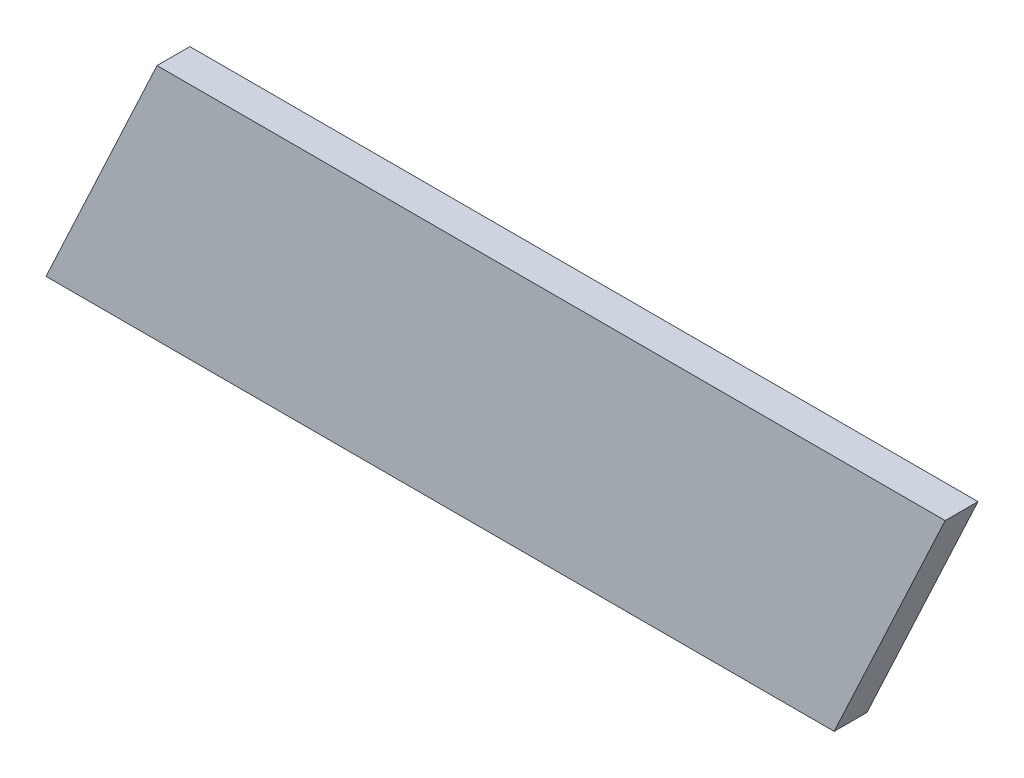
ISO-10303-21;
HEADER;
FILE_DESCRIPTION(('STEP AP214'),'2;1');
FILE_NAME('part.step','',(''),(''),'','','');
FILE_SCHEMA(('AUTOMOTIVE_DESIGN { 1 0 10303 214 1 1 1 1 }'));
ENDSEC;
DATA;
#1=APPLICATION_CONTEXT('core data for automotive mechanical design processes');
#2=APPLICATION_PROTOCOL_DEFINITION('international standard','automotive_design',2000,#1);
#3=PRODUCT_CONTEXT('',#1,'mechanical');
#4=PRODUCT('Part','Part','',(#3));
#5=PRODUCT_RELATED_PRODUCT_CATEGORY('part','',(#4));
#6=PRODUCT_DEFINITION_FORMATION('','',#4);
#7=PRODUCT_DEFINITION_CONTEXT('part definition',#1,'design');
#8=PRODUCT_DEFINITION('design','',#6,#7);
#9=PRODUCT_DEFINITION_SHAPE('','',#8);
#10=(LENGTH_UNIT() NAMED_UNIT(*) SI_UNIT(.MILLI.,.METRE.));
#11=(NAMED_UNIT(*) PLANE_ANGLE_UNIT() SI_UNIT($,.RADIAN.));
#12=(NAMED_UNIT(*) SI_UNIT($,.STERADIAN.) SOLID_ANGLE_UNIT());
#13=UNCERTAINTY_MEASURE_WITH_UNIT(LENGTH_MEASURE(1.E-05),#10,'distance_accuracy_value','');
#14=(GEOMETRIC_REPRESENTATION_CONTEXT(3) GLOBAL_UNCERTAINTY_ASSIGNED_CONTEXT((#13)) GLOBAL_UNIT_ASSIGNED_CONTEXT((#10,
#11,#12)) REPRESENTATION_CONTEXT('',''));
#15=CARTESIAN_POINT('',(0.,0.,0.));
#16=DIRECTION('',(0.,0.,1.));
#17=DIRECTION('',(1.,0.,0.));
#18=AXIS2_PLACEMENT_3D('',#15,#16,#17);
#19=CARTESIAN_POINT('',(0.,0.,5.));
#20=DIRECTION('',(0.906307787036651,-0.422618261740697,0.));
#21=DIRECTION('',(0.422618261740697,0.906307787036651,0.));
#22=AXIS2_PLACEMENT_3D('',#19,#20,#21);
#23=PLANE('',#22);
#24=DIRECTION('',(-0.422618261740697,-0.906307787036651,0.));
#25=VECTOR('',#24,1.);
#26=CARTESIAN_POINT('',(0.,0.,0.));
#27=LINE('',#26,#25);
#28=CARTESIAN_POINT('',(16.9047304696279,36.252311481466,0.));
#29=VERTEX_POINT('',#28);
#30=CARTESIAN_POINT('',(0.,0.,0.));
#31=VERTEX_POINT('',#30);
#32=EDGE_CURVE('E107',#29,#31,#27,.T.);
#33=ORIENTED_EDGE('',*,*,#32,.T.);
#34=DIRECTION('',(0.,0.,-1.));
#35=VECTOR('',#34,1.);
#36=CARTESIAN_POINT('',(0.,0.,5.));
#37=LINE('',#36,#35);
#38=CARTESIAN_POINT('',(0.,0.,5.));
#39=VERTEX_POINT('',#38);
#40=EDGE_CURVE('E11',#39,#31,#37,.T.);
#41=ORIENTED_EDGE('',*,*,#40,.F.);
#42=DIRECTION('',(-0.422618261740697,-0.906307787036651,0.));
#43=VECTOR('',#42,1.);
#44=CARTESIAN_POINT('',(0.,0.,5.));
#45=LINE('',#44,#43);
#46=CARTESIAN_POINT('',(16.9047304696279,36.252311481466,5.));
#47=VERTEX_POINT('',#46);
#48=EDGE_CURVE('E91',#47,#39,#45,.T.);
#49=ORIENTED_EDGE('',*,*,#48,.F.);
#50=DIRECTION('',(0.,0.,-1.));
#51=VECTOR('',#50,1.);
#52=CARTESIAN_POINT('',(16.9047304696279,36.252311481466,5.));
#53=LINE('',#52,#51);
#54=EDGE_CURVE('E103',#47,#29,#53,.T.);
#55=ORIENTED_EDGE('',*,*,#54,.T.);
#56=EDGE_LOOP('',(#33,#41,#49,#55));
#57=FACE_BOUND('',#56,.T.);
#58=ADVANCED_FACE('F39',(#57),#23,.F.);
#59=CARTESIAN_POINT('',(0.,0.,5.));
#60=DIRECTION('',(0.,1.,0.));
#61=DIRECTION('',(-1.,0.,0.));
#62=AXIS2_PLACEMENT_3D('',#59,#60,#61);
#63=PLANE('',#62);
#64=DIRECTION('',(1.,0.,0.));
#65=VECTOR('',#64,1.);
#66=CARTESIAN_POINT('',(0.,0.,0.));
#67=LINE('',#66,#65);
#68=CARTESIAN_POINT('',(120.,0.,0.));
#69=VERTEX_POINT('',#68);
#70=EDGE_CURVE('E96',#31,#69,#67,.T.);
#71=ORIENTED_EDGE('',*,*,#70,.T.);
#72=DIRECTION('',(0.,0.,-1.));
#73=VECTOR('',#72,1.);
#74=CARTESIAN_POINT('',(120.,0.,5.));
#75=LINE('',#74,#73);
#76=CARTESIAN_POINT('',(120.,0.,5.));
#77=VERTEX_POINT('',#76);
#78=EDGE_CURVE('E48',#77,#69,#75,.T.);
#79=ORIENTED_EDGE('',*,*,#78,.F.);
#80=DIRECTION('',(1.,0.,0.));
#81=VECTOR('',#80,1.);
#82=CARTESIAN_POINT('',(0.,0.,5.));
#83=LINE('',#82,#81);
#84=EDGE_CURVE('E86',#39,#77,#83,.T.);
#85=ORIENTED_EDGE('',*,*,#84,.F.);
#86=ORIENTED_EDGE('',*,*,#40,.T.);
#87=EDGE_LOOP('',(#71,#79,#85,#86));
#88=FACE_BOUND('',#87,.T.);
#89=ADVANCED_FACE('F95',(#88),#63,.F.);
#90=CARTESIAN_POINT('',(120.,0.,5.));
#91=DIRECTION('',(-0.906307787036651,0.422618261740697,0.));
#92=DIRECTION('',(-0.422618261740697,-0.906307787036651,0.));
#93=AXIS2_PLACEMENT_3D('',#90,#91,#92);
#94=PLANE('',#93);
#95=DIRECTION('',(0.422618261740697,0.906307787036651,0.));
#96=VECTOR('',#95,1.);
#97=CARTESIAN_POINT('',(120.,0.,0.));
#98=LINE('',#97,#96);
#99=CARTESIAN_POINT('',(136.904730469628,36.252311481466,0.));
#100=VERTEX_POINT('',#99);
#101=EDGE_CURVE('E73',#69,#100,#98,.T.);
#102=ORIENTED_EDGE('',*,*,#101,.T.);
#103=DIRECTION('',(0.,0.,-1.));
#104=VECTOR('',#103,1.);
#105=CARTESIAN_POINT('',(136.904730469628,36.252311481466,5.));
#106=LINE('',#105,#104);
#107=CARTESIAN_POINT('',(136.904730469628,36.252311481466,5.));
#108=VERTEX_POINT('',#107);
#109=EDGE_CURVE('E98',#108,#100,#106,.T.);
#110=ORIENTED_EDGE('',*,*,#109,.F.);
#111=DIRECTION('',(0.422618261740697,0.906307787036651,0.));
#112=VECTOR('',#111,1.);
#113=CARTESIAN_POINT('',(120.,0.,5.));
#114=LINE('',#113,#112);
#115=EDGE_CURVE('E89',#77,#108,#114,.T.);
#116=ORIENTED_EDGE('',*,*,#115,.F.);
#117=ORIENTED_EDGE('',*,*,#78,.T.);
#118=EDGE_LOOP('',(#102,#110,#116,#117));
#119=FACE_BOUND('',#118,.T.);
#120=ADVANCED_FACE('F99',(#119),#94,.F.);
#121=CARTESIAN_POINT('',(16.9047304696279,36.252311481466,5.));
#122=DIRECTION('',(0.,-1.,0.));
#123=DIRECTION('',(0.,0.,-1.));
#124=AXIS2_PLACEMENT_3D('',#121,#122,#123);
#125=PLANE('',#124);
#126=DIRECTION('',(-1.,0.,0.));
#127=VECTOR('',#126,1.);
#128=CARTESIAN_POINT('',(16.9047304696279,36.252311481466,0.));
#129=LINE('',#128,#127);
#130=EDGE_CURVE('E79',#100,#29,#129,.T.);
#131=ORIENTED_EDGE('',*,*,#130,.T.);
#132=ORIENTED_EDGE('',*,*,#54,.F.);
#133=DIRECTION('',(-1.,0.,0.));
#134=VECTOR('',#133,1.);
#135=CARTESIAN_POINT('',(16.9047304696279,36.252311481466,5.));
#136=LINE('',#135,#134);
#137=EDGE_CURVE('E56',#108,#47,#136,.T.);
#138=ORIENTED_EDGE('',*,*,#137,.F.);
#139=ORIENTED_EDGE('',*,*,#109,.T.);
#140=EDGE_LOOP('',(#131,#132,#138,#139));
#141=FACE_BOUND('',#140,.T.);
#142=ADVANCED_FACE('F120',(#141),#125,.F.);
#143=CARTESIAN_POINT('',(0.,0.,5.));
#144=DIRECTION('',(0.,0.,-1.));
#145=DIRECTION('',(-1.,0.,0.));
#146=AXIS2_PLACEMENT_3D('',#143,#144,#145);
#147=PLANE('',#146);
#148=ORIENTED_EDGE('',*,*,#48,.T.);
#149=ORIENTED_EDGE('',*,*,#84,.T.);
#150=ORIENTED_EDGE('',*,*,#115,.T.);
#151=ORIENTED_EDGE('',*,*,#137,.T.);
#152=EDGE_LOOP('',(#148,#149,#150,#151));
#153=FACE_BOUND('',#152,.T.);
#154=ADVANCED_FACE('F87',(#153),#147,.F.);
#155=CARTESIAN_POINT('',(0.,0.,0.));
#156=DIRECTION('',(0.,0.,-1.));
#157=DIRECTION('',(-1.,0.,0.));
#158=AXIS2_PLACEMENT_3D('',#155,#156,#157);
#159=PLANE('',#158);
#160=ORIENTED_EDGE('',*,*,#32,.F.);
#161=ORIENTED_EDGE('',*,*,#130,.F.);
#162=ORIENTED_EDGE('',*,*,#101,.F.);
#163=ORIENTED_EDGE('',*,*,#70,.F.);
#164=EDGE_LOOP('',(#160,#161,#162,#163));
#165=FACE_BOUND('',#164,.T.);
#166=ADVANCED_FACE('F123',(#165),#159,.T.);
#167=CLOSED_SHELL('',(#58,#89,#120,#142,#154,#166));
#168=MANIFOLD_SOLID_BREP('B2',#167);
#169=ADVANCED_BREP_SHAPE_REPRESENTATION('',(#18,#168),#14);
#170=SHAPE_DEFINITION_REPRESENTATION(#9,#169);
ENDSEC;
END-ISO-10303-21;
